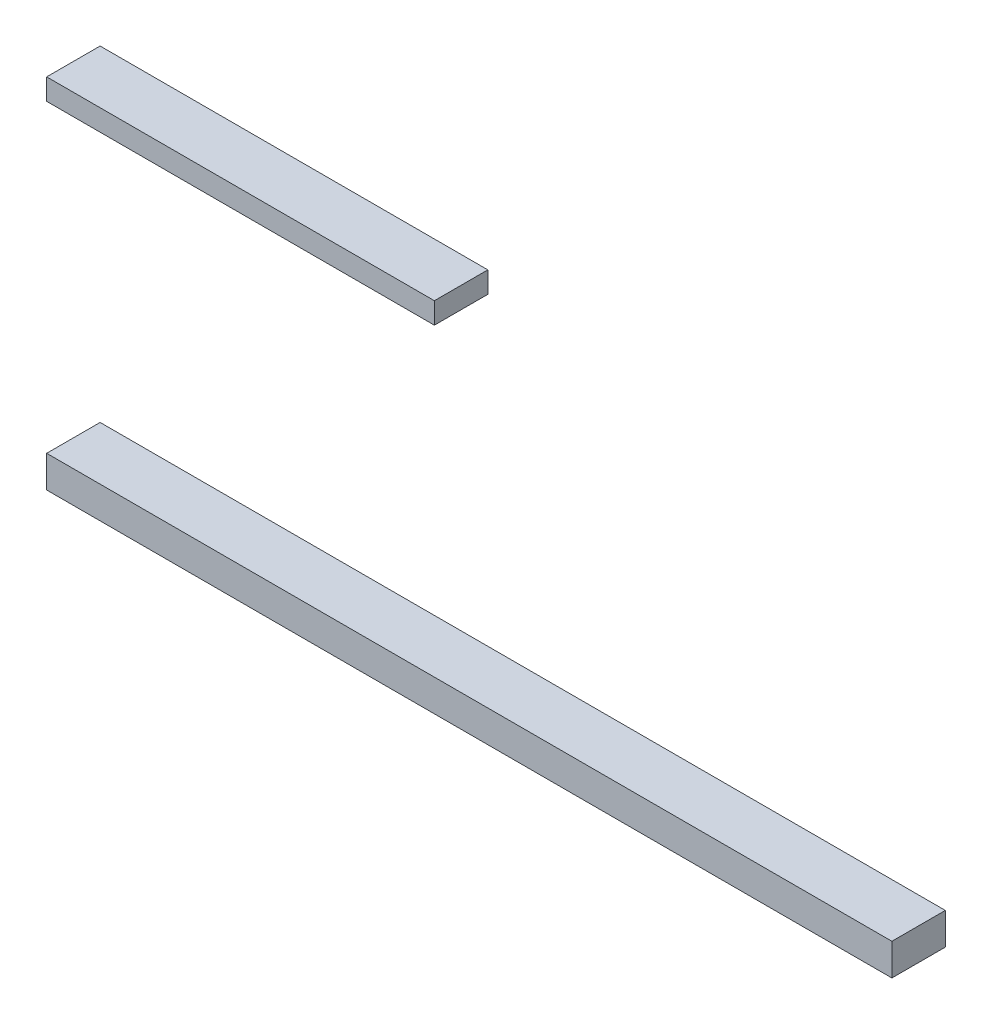
ISO-10303-21;
HEADER;
FILE_DESCRIPTION(('STEP AP214'),'2;1');
FILE_NAME('part.step','',(''),(''),'','','');
FILE_SCHEMA(('AUTOMOTIVE_DESIGN { 1 0 10303 214 1 1 1 1 }'));
ENDSEC;
DATA;
#1=APPLICATION_CONTEXT('core data for automotive mechanical design processes');
#2=APPLICATION_PROTOCOL_DEFINITION('international standard','automotive_design',2000,#1);
#3=PRODUCT_CONTEXT('',#1,'mechanical');
#4=PRODUCT('Part','Part','',(#3));
#5=PRODUCT_RELATED_PRODUCT_CATEGORY('part','',(#4));
#6=PRODUCT_DEFINITION_FORMATION('','',#4);
#7=PRODUCT_DEFINITION_CONTEXT('part definition',#1,'design');
#8=PRODUCT_DEFINITION('design','',#6,#7);
#9=PRODUCT_DEFINITION_SHAPE('','',#8);
#10=(LENGTH_UNIT() NAMED_UNIT(*) SI_UNIT(.MILLI.,.METRE.));
#11=(NAMED_UNIT(*) PLANE_ANGLE_UNIT() SI_UNIT($,.RADIAN.));
#12=(NAMED_UNIT(*) SI_UNIT($,.STERADIAN.) SOLID_ANGLE_UNIT());
#13=UNCERTAINTY_MEASURE_WITH_UNIT(LENGTH_MEASURE(1.E-05),#10,'distance_accuracy_value','');
#14=(GEOMETRIC_REPRESENTATION_CONTEXT(3) GLOBAL_UNCERTAINTY_ASSIGNED_CONTEXT((#13)) GLOBAL_UNIT_ASSIGNED_CONTEXT((#10,
#11,#12)) REPRESENTATION_CONTEXT('',''));
#15=CARTESIAN_POINT('',(0.,0.,0.));
#16=DIRECTION('',(0.,0.,1.));
#17=DIRECTION('',(1.,0.,0.));
#18=AXIS2_PLACEMENT_3D('',#15,#16,#17);
#19=CARTESIAN_POINT('',(3199.,-1706.,4239.8220873053));
#20=DIRECTION('',(1.,0.,0.));
#21=DIRECTION('',(0.,0.,-1.));
#22=AXIS2_PLACEMENT_3D('',#19,#20,#21);
#23=PLANE('',#22);
#24=DIRECTION('',(0.,-1.,0.));
#25=VECTOR('',#24,1.);
#26=CARTESIAN_POINT('',(3199.,-1706.,252.));
#27=LINE('',#26,#25);
#28=CARTESIAN_POINT('',(3199.,-1706.,252.));
#29=VERTEX_POINT('',#28);
#30=CARTESIAN_POINT('',(3199.,-1806.,252.));
#31=VERTEX_POINT('',#30);
#32=EDGE_CURVE('E105',#29,#31,#27,.T.);
#33=ORIENTED_EDGE('',*,*,#32,.F.);
#34=DIRECTION('',(0.,0.,-1.));
#35=VECTOR('',#34,1.);
#36=CARTESIAN_POINT('',(3199.,-1706.,4239.8220873053));
#37=LINE('',#36,#35);
#38=CARTESIAN_POINT('',(3199.,-1706.,0.));
#39=VERTEX_POINT('',#38);
#40=EDGE_CURVE('E12',#29,#39,#37,.T.);
#41=ORIENTED_EDGE('',*,*,#40,.T.);
#42=DIRECTION('',(0.,-1.,0.));
#43=VECTOR('',#42,1.);
#44=CARTESIAN_POINT('',(3199.,-1706.,0.));
#45=LINE('',#44,#43);
#46=CARTESIAN_POINT('',(3199.,-1806.,0.));
#47=VERTEX_POINT('',#46);
#48=EDGE_CURVE('E59',#39,#47,#45,.T.);
#49=ORIENTED_EDGE('',*,*,#48,.T.);
#50=DIRECTION('',(0.,0.,-1.));
#51=VECTOR('',#50,1.);
#52=CARTESIAN_POINT('',(3199.,-1806.,4239.8220873053));
#53=LINE('',#52,#51);
#54=EDGE_CURVE('E112',#31,#47,#53,.T.);
#55=ORIENTED_EDGE('',*,*,#54,.F.);
#56=EDGE_LOOP('',(#33,#41,#49,#55));
#57=FACE_BOUND('',#56,.T.);
#58=ADVANCED_FACE('F49',(#57),#23,.F.);
#59=CARTESIAN_POINT('',(3199.,-1806.,4239.8220873053));
#60=DIRECTION('',(0.,1.,0.));
#61=DIRECTION('',(0.,0.,1.));
#62=AXIS2_PLACEMENT_3D('',#59,#60,#61);
#63=PLANE('',#62);
#64=DIRECTION('',(1.,0.,0.));
#65=VECTOR('',#64,1.);
#66=CARTESIAN_POINT('',(3199.,-1806.,252.));
#67=LINE('',#66,#65);
#68=CARTESIAN_POINT('',(5027.,-1806.,252.));
#69=VERTEX_POINT('',#68);
#70=EDGE_CURVE('E109',#31,#69,#67,.T.);
#71=ORIENTED_EDGE('',*,*,#70,.F.);
#72=ORIENTED_EDGE('',*,*,#54,.T.);
#73=DIRECTION('',(1.,0.,0.));
#74=VECTOR('',#73,1.);
#75=CARTESIAN_POINT('',(3199.,-1806.,0.));
#76=LINE('',#75,#74);
#77=CARTESIAN_POINT('',(5027.,-1806.,0.));
#78=VERTEX_POINT('',#77);
#79=EDGE_CURVE('E119',#47,#78,#76,.T.);
#80=ORIENTED_EDGE('',*,*,#79,.T.);
#81=DIRECTION('',(0.,0.,-1.));
#82=VECTOR('',#81,1.);
#83=CARTESIAN_POINT('',(5027.,-1806.,4239.8220873053));
#84=LINE('',#83,#82);
#85=EDGE_CURVE('E86',#69,#78,#84,.T.);
#86=ORIENTED_EDGE('',*,*,#85,.F.);
#87=EDGE_LOOP('',(#71,#72,#80,#86));
#88=FACE_BOUND('',#87,.T.);
#89=ADVANCED_FACE('F122',(#88),#63,.F.);
#90=CARTESIAN_POINT('',(5027.,-1706.,4239.8220873053));
#91=DIRECTION('',(-1.,0.,0.));
#92=DIRECTION('',(0.,0.,1.));
#93=AXIS2_PLACEMENT_3D('',#90,#91,#92);
#94=PLANE('',#93);
#95=DIRECTION('',(0.,1.,0.));
#96=VECTOR('',#95,1.);
#97=CARTESIAN_POINT('',(5027.,-1706.,252.));
#98=LINE('',#97,#96);
#99=CARTESIAN_POINT('',(5027.,-1706.,252.));
#100=VERTEX_POINT('',#99);
#101=EDGE_CURVE('E81',#69,#100,#98,.T.);
#102=ORIENTED_EDGE('',*,*,#101,.F.);
#103=ORIENTED_EDGE('',*,*,#85,.T.);
#104=DIRECTION('',(0.,1.,0.));
#105=VECTOR('',#104,1.);
#106=CARTESIAN_POINT('',(5027.,-1706.,0.));
#107=LINE('',#106,#105);
#108=CARTESIAN_POINT('',(5027.,-1706.,0.));
#109=VERTEX_POINT('',#108);
#110=EDGE_CURVE('E99',#78,#109,#107,.T.);
#111=ORIENTED_EDGE('',*,*,#110,.T.);
#112=DIRECTION('',(0.,0.,-1.));
#113=VECTOR('',#112,1.);
#114=CARTESIAN_POINT('',(5027.,-1706.,4239.8220873053));
#115=LINE('',#114,#113);
#116=EDGE_CURVE('E93',#100,#109,#115,.T.);
#117=ORIENTED_EDGE('',*,*,#116,.F.);
#118=EDGE_LOOP('',(#102,#103,#111,#117));
#119=FACE_BOUND('',#118,.T.);
#120=ADVANCED_FACE('F102',(#119),#94,.F.);
#121=CARTESIAN_POINT('',(3199.,-1706.,4239.8220873053));
#122=DIRECTION('',(0.,-1.,0.));
#123=DIRECTION('',(0.,0.,-1.));
#124=AXIS2_PLACEMENT_3D('',#121,#122,#123);
#125=PLANE('',#124);
#126=DIRECTION('',(-1.,0.,0.));
#127=VECTOR('',#126,1.);
#128=CARTESIAN_POINT('',(3199.,-1706.,252.));
#129=LINE('',#128,#127);
#130=EDGE_CURVE('E98',#100,#29,#129,.T.);
#131=ORIENTED_EDGE('',*,*,#130,.F.);
#132=ORIENTED_EDGE('',*,*,#116,.T.);
#133=DIRECTION('',(-1.,0.,0.));
#134=VECTOR('',#133,1.);
#135=CARTESIAN_POINT('',(3199.,-1706.,0.));
#136=LINE('',#135,#134);
#137=EDGE_CURVE('E53',#109,#39,#136,.T.);
#138=ORIENTED_EDGE('',*,*,#137,.T.);
#139=ORIENTED_EDGE('',*,*,#40,.F.);
#140=EDGE_LOOP('',(#131,#132,#138,#139));
#141=FACE_BOUND('',#140,.T.);
#142=ADVANCED_FACE('F94',(#141),#125,.F.);
#143=CARTESIAN_POINT('',(0.,0.,0.));
#144=DIRECTION('',(0.,0.,1.));
#145=DIRECTION('',(1.,0.,0.));
#146=AXIS2_PLACEMENT_3D('',#143,#144,#145);
#147=PLANE('',#146);
#148=ORIENTED_EDGE('',*,*,#48,.F.);
#149=ORIENTED_EDGE('',*,*,#137,.F.);
#150=ORIENTED_EDGE('',*,*,#110,.F.);
#151=ORIENTED_EDGE('',*,*,#79,.F.);
#152=EDGE_LOOP('',(#148,#149,#150,#151));
#153=FACE_BOUND('',#152,.T.);
#154=ADVANCED_FACE('F51',(#153),#147,.F.);
#155=CARTESIAN_POINT('',(0.,0.,252.));
#156=DIRECTION('',(0.,0.,1.));
#157=DIRECTION('',(0.,-1.,0.));
#158=AXIS2_PLACEMENT_3D('',#155,#156,#157);
#159=PLANE('',#158);
#160=ORIENTED_EDGE('',*,*,#130,.T.);
#161=ORIENTED_EDGE('',*,*,#32,.T.);
#162=ORIENTED_EDGE('',*,*,#70,.T.);
#163=ORIENTED_EDGE('',*,*,#101,.T.);
#164=EDGE_LOOP('',(#160,#161,#162,#163));
#165=FACE_BOUND('',#164,.T.);
#166=ADVANCED_FACE('F130',(#165),#159,.T.);
#167=CLOSED_SHELL('',(#58,#89,#120,#142,#154,#166));
#168=MANIFOLD_SOLID_BREP('B2',#167);
#169=CARTESIAN_POINT('',(3199.,-3242.99999999999,4239.8220873053));
#170=DIRECTION('',(1.,0.,0.));
#171=DIRECTION('',(0.,0.,-1.));
#172=AXIS2_PLACEMENT_3D('',#169,#170,#171);
#173=PLANE('',#172);
#174=DIRECTION('',(0.,-1.,0.));
#175=VECTOR('',#174,1.);
#176=CARTESIAN_POINT('',(3199.,-3242.99999999999,252.));
#177=LINE('',#176,#175);
#178=CARTESIAN_POINT('',(3199.,-3242.99999999999,252.));
#179=VERTEX_POINT('',#178);
#180=CARTESIAN_POINT('',(3199.,-3392.99999999999,252.));
#181=VERTEX_POINT('',#180);
#182=EDGE_CURVE('E223',#179,#181,#177,.T.);
#183=ORIENTED_EDGE('',*,*,#182,.F.);
#184=DIRECTION('',(0.,0.,-1.));
#185=VECTOR('',#184,1.);
#186=CARTESIAN_POINT('',(3199.,-3242.99999999999,4239.8220873053));
#187=LINE('',#186,#185);
#188=CARTESIAN_POINT('',(3199.,-3242.99999999999,0.));
#189=VERTEX_POINT('',#188);
#190=EDGE_CURVE('E177',#179,#189,#187,.T.);
#191=ORIENTED_EDGE('',*,*,#190,.T.);
#192=DIRECTION('',(0.,-1.,0.));
#193=VECTOR('',#192,1.);
#194=CARTESIAN_POINT('',(3199.,-3242.99999999999,0.));
#195=LINE('',#194,#193);
#196=CARTESIAN_POINT('',(3199.,-3392.99999999999,0.));
#197=VERTEX_POINT('',#196);
#198=EDGE_CURVE('E221',#189,#197,#195,.T.);
#199=ORIENTED_EDGE('',*,*,#198,.T.);
#200=DIRECTION('',(0.,0.,-1.));
#201=VECTOR('',#200,1.);
#202=CARTESIAN_POINT('',(3199.,-3392.99999999999,4239.8220873053));
#203=LINE('',#202,#201);
#204=EDGE_CURVE('E212',#181,#197,#203,.T.);
#205=ORIENTED_EDGE('',*,*,#204,.F.);
#206=EDGE_LOOP('',(#183,#191,#199,#205));
#207=FACE_BOUND('',#206,.T.);
#208=ADVANCED_FACE('F173',(#207),#173,.F.);
#209=CARTESIAN_POINT('',(3199.,-3392.99999999999,4239.8220873053));
#210=DIRECTION('',(0.,1.,0.));
#211=DIRECTION('',(0.,0.,1.));
#212=AXIS2_PLACEMENT_3D('',#209,#210,#211);
#213=PLANE('',#212);
#214=DIRECTION('',(1.,0.,0.));
#215=VECTOR('',#214,1.);
#216=CARTESIAN_POINT('',(3199.,-3392.99999999999,252.));
#217=LINE('',#216,#215);
#218=CARTESIAN_POINT('',(7184.,-3392.99999999999,252.));
#219=VERTEX_POINT('',#218);
#220=EDGE_CURVE('E182',#181,#219,#217,.T.);
#221=ORIENTED_EDGE('',*,*,#220,.F.);
#222=ORIENTED_EDGE('',*,*,#204,.T.);
#223=DIRECTION('',(1.,0.,0.));
#224=VECTOR('',#223,1.);
#225=CARTESIAN_POINT('',(3199.,-3392.99999999999,0.));
#226=LINE('',#225,#224);
#227=CARTESIAN_POINT('',(7184.,-3392.99999999999,0.));
#228=VERTEX_POINT('',#227);
#229=EDGE_CURVE('E233',#197,#228,#226,.T.);
#230=ORIENTED_EDGE('',*,*,#229,.T.);
#231=DIRECTION('',(0.,0.,-1.));
#232=VECTOR('',#231,1.);
#233=CARTESIAN_POINT('',(7184.,-3392.99999999999,4239.8220873053));
#234=LINE('',#233,#232);
#235=EDGE_CURVE('E242',#219,#228,#234,.T.);
#236=ORIENTED_EDGE('',*,*,#235,.F.);
#237=EDGE_LOOP('',(#221,#222,#230,#236));
#238=FACE_BOUND('',#237,.T.);
#239=ADVANCED_FACE('F246',(#238),#213,.F.);
#240=CARTESIAN_POINT('',(7184.,-3242.99999999999,4239.8220873053));
#241=DIRECTION('',(-1.,0.,0.));
#242=DIRECTION('',(0.,0.,1.));
#243=AXIS2_PLACEMENT_3D('',#240,#241,#242);
#244=PLANE('',#243);
#245=DIRECTION('',(0.,1.,0.));
#246=VECTOR('',#245,1.);
#247=CARTESIAN_POINT('',(7184.,-3242.99999999999,252.));
#248=LINE('',#247,#246);
#249=CARTESIAN_POINT('',(7184.,-3242.99999999999,252.));
#250=VERTEX_POINT('',#249);
#251=EDGE_CURVE('E47',#219,#250,#248,.T.);
#252=ORIENTED_EDGE('',*,*,#251,.F.);
#253=ORIENTED_EDGE('',*,*,#235,.T.);
#254=DIRECTION('',(0.,1.,0.));
#255=VECTOR('',#254,1.);
#256=CARTESIAN_POINT('',(7184.,-3242.99999999999,0.));
#257=LINE('',#256,#255);
#258=CARTESIAN_POINT('',(7184.,-3242.99999999999,0.));
#259=VERTEX_POINT('',#258);
#260=EDGE_CURVE('E243',#228,#259,#257,.T.);
#261=ORIENTED_EDGE('',*,*,#260,.T.);
#262=DIRECTION('',(0.,0.,-1.));
#263=VECTOR('',#262,1.);
#264=CARTESIAN_POINT('',(7184.,-3242.99999999999,4239.8220873053));
#265=LINE('',#264,#263);
#266=EDGE_CURVE('E195',#250,#259,#265,.T.);
#267=ORIENTED_EDGE('',*,*,#266,.F.);
#268=EDGE_LOOP('',(#252,#253,#261,#267));
#269=FACE_BOUND('',#268,.T.);
#270=ADVANCED_FACE('F245',(#269),#244,.F.);
#271=CARTESIAN_POINT('',(3199.,-3242.99999999999,4239.8220873053));
#272=DIRECTION('',(0.,-1.,0.));
#273=DIRECTION('',(0.,0.,-1.));
#274=AXIS2_PLACEMENT_3D('',#271,#272,#273);
#275=PLANE('',#274);
#276=DIRECTION('',(-1.,0.,0.));
#277=VECTOR('',#276,1.);
#278=CARTESIAN_POINT('',(3199.,-3242.99999999999,252.));
#279=LINE('',#278,#277);
#280=EDGE_CURVE('E230',#250,#179,#279,.T.);
#281=ORIENTED_EDGE('',*,*,#280,.F.);
#282=ORIENTED_EDGE('',*,*,#266,.T.);
#283=DIRECTION('',(-1.,0.,0.));
#284=VECTOR('',#283,1.);
#285=CARTESIAN_POINT('',(3199.,-3242.99999999999,0.));
#286=LINE('',#285,#284);
#287=EDGE_CURVE('E226',#259,#189,#286,.T.);
#288=ORIENTED_EDGE('',*,*,#287,.T.);
#289=ORIENTED_EDGE('',*,*,#190,.F.);
#290=EDGE_LOOP('',(#281,#282,#288,#289));
#291=FACE_BOUND('',#290,.T.);
#292=ADVANCED_FACE('F227',(#291),#275,.F.);
#293=CARTESIAN_POINT('',(0.,0.,0.));
#294=DIRECTION('',(0.,0.,1.));
#295=DIRECTION('',(1.,0.,0.));
#296=AXIS2_PLACEMENT_3D('',#293,#294,#295);
#297=PLANE('',#296);
#298=ORIENTED_EDGE('',*,*,#198,.F.);
#299=ORIENTED_EDGE('',*,*,#287,.F.);
#300=ORIENTED_EDGE('',*,*,#260,.F.);
#301=ORIENTED_EDGE('',*,*,#229,.F.);
#302=EDGE_LOOP('',(#298,#299,#300,#301));
#303=FACE_BOUND('',#302,.T.);
#304=ADVANCED_FACE('F232',(#303),#297,.F.);
#305=CARTESIAN_POINT('',(0.,0.,252.));
#306=DIRECTION('',(0.,0.,1.));
#307=DIRECTION('',(0.,-1.,0.));
#308=AXIS2_PLACEMENT_3D('',#305,#306,#307);
#309=PLANE('',#308);
#310=ORIENTED_EDGE('',*,*,#280,.T.);
#311=ORIENTED_EDGE('',*,*,#182,.T.);
#312=ORIENTED_EDGE('',*,*,#220,.T.);
#313=ORIENTED_EDGE('',*,*,#251,.T.);
#314=EDGE_LOOP('',(#310,#311,#312,#313));
#315=FACE_BOUND('',#314,.T.);
#316=ADVANCED_FACE('F175',(#315),#309,.T.);
#317=CLOSED_SHELL('',(#208,#239,#270,#292,#304,#316));
#318=MANIFOLD_SOLID_BREP('B6',#317);
#319=ADVANCED_BREP_SHAPE_REPRESENTATION('',(#18,#168,#318),#14);
#320=SHAPE_DEFINITION_REPRESENTATION(#9,#319);
ENDSEC;
END-ISO-10303-21;
